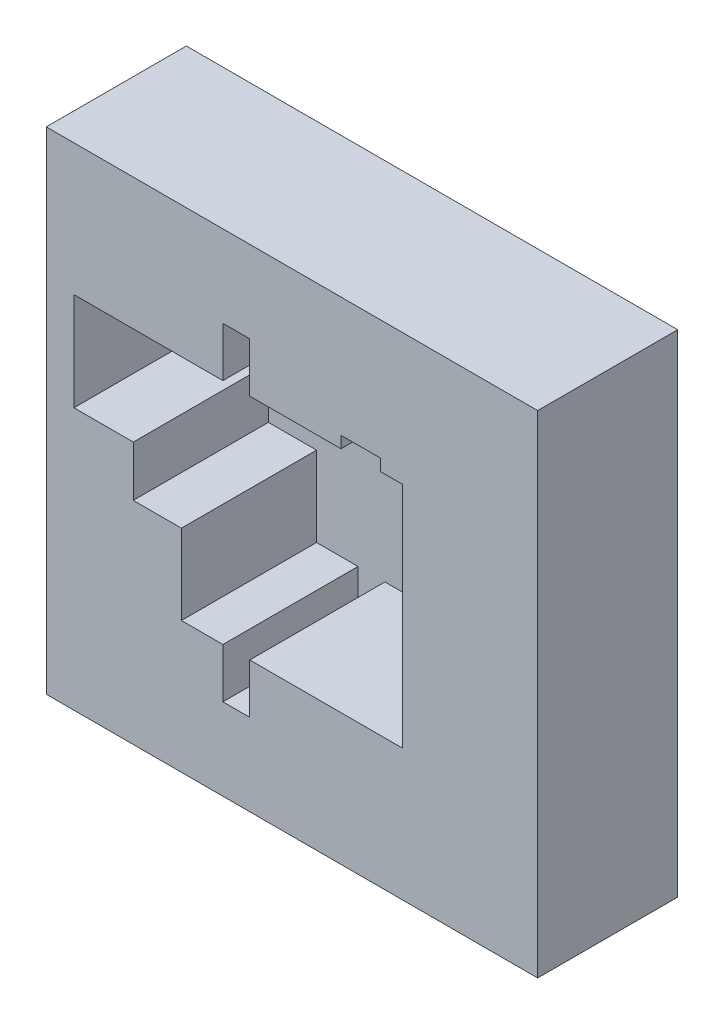
ISO-10303-21;
HEADER;
FILE_DESCRIPTION(('STEP AP214'),'2;1');
FILE_NAME('part.step','',(''),(''),'','','');
FILE_SCHEMA(('AUTOMOTIVE_DESIGN { 1 0 10303 214 1 1 1 1 }'));
ENDSEC;
DATA;
#1=APPLICATION_CONTEXT('core data for automotive mechanical design processes');
#2=APPLICATION_PROTOCOL_DEFINITION('international standard','automotive_design',2000,#1);
#3=PRODUCT_CONTEXT('',#1,'mechanical');
#4=PRODUCT('Part','Part','',(#3));
#5=PRODUCT_RELATED_PRODUCT_CATEGORY('part','',(#4));
#6=PRODUCT_DEFINITION_FORMATION('','',#4);
#7=PRODUCT_DEFINITION_CONTEXT('part definition',#1,'design');
#8=PRODUCT_DEFINITION('design','',#6,#7);
#9=PRODUCT_DEFINITION_SHAPE('','',#8);
#10=(LENGTH_UNIT() NAMED_UNIT(*) SI_UNIT(.MILLI.,.METRE.));
#11=(NAMED_UNIT(*) PLANE_ANGLE_UNIT() SI_UNIT($,.RADIAN.));
#12=(NAMED_UNIT(*) SI_UNIT($,.STERADIAN.) SOLID_ANGLE_UNIT());
#13=UNCERTAINTY_MEASURE_WITH_UNIT(LENGTH_MEASURE(1.E-05),#10,'distance_accuracy_value','');
#14=(GEOMETRIC_REPRESENTATION_CONTEXT(3) GLOBAL_UNCERTAINTY_ASSIGNED_CONTEXT((#13)) GLOBAL_UNIT_ASSIGNED_CONTEXT((#10,
#11,#12)) REPRESENTATION_CONTEXT('',''));
#15=CARTESIAN_POINT('',(0.,0.,0.));
#16=DIRECTION('',(0.,0.,1.));
#17=DIRECTION('',(1.,0.,0.));
#18=AXIS2_PLACEMENT_3D('',#15,#16,#17);
#19=CARTESIAN_POINT('',(-48.3281879194631,53.2718120805369,14.478));
#20=DIRECTION('',(1.,0.,0.));
#21=DIRECTION('',(0.,1.,0.));
#22=AXIS2_PLACEMENT_3D('',#19,#20,#21);
#23=PLANE('',#22);
#24=DIRECTION('',(0.,-1.,0.));
#25=VECTOR('',#24,1.);
#26=CARTESIAN_POINT('',(-48.3281879194631,53.2718120805369,0.));
#27=LINE('',#26,#25);
#28=CARTESIAN_POINT('',(-48.3281879194631,53.2718120805369,0.));
#29=VERTEX_POINT('',#28);
#30=CARTESIAN_POINT('',(-48.3281879194631,2.47181208053691,0.));
#31=VERTEX_POINT('',#30);
#32=EDGE_CURVE('E370',#29,#31,#27,.T.);
#33=ORIENTED_EDGE('',*,*,#32,.T.);
#34=DIRECTION('',(0.,0.,-1.));
#35=VECTOR('',#34,1.);
#36=CARTESIAN_POINT('',(-48.3281879194631,2.47181208053691,14.478));
#37=LINE('',#36,#35);
#38=CARTESIAN_POINT('',(-48.3281879194631,2.47181208053691,14.478));
#39=VERTEX_POINT('',#38);
#40=EDGE_CURVE('E11',#39,#31,#37,.T.);
#41=ORIENTED_EDGE('',*,*,#40,.F.);
#42=DIRECTION('',(0.,-1.,0.));
#43=VECTOR('',#42,1.);
#44=CARTESIAN_POINT('',(-48.3281879194631,53.2718120805369,14.478));
#45=LINE('',#44,#43);
#46=CARTESIAN_POINT('',(-48.3281879194631,53.2718120805369,14.478));
#47=VERTEX_POINT('',#46);
#48=EDGE_CURVE('E424',#47,#39,#45,.T.);
#49=ORIENTED_EDGE('',*,*,#48,.F.);
#50=DIRECTION('',(0.,0.,-1.));
#51=VECTOR('',#50,1.);
#52=CARTESIAN_POINT('',(-48.3281879194631,53.2718120805369,14.478));
#53=LINE('',#52,#51);
#54=EDGE_CURVE('E434',#47,#29,#53,.T.);
#55=ORIENTED_EDGE('',*,*,#54,.T.);
#56=EDGE_LOOP('',(#33,#41,#49,#55));
#57=FACE_BOUND('',#56,.T.);
#58=ADVANCED_FACE('F45',(#57),#23,.F.);
#59=CARTESIAN_POINT('',(-48.3281879194631,2.47181208053691,14.478));
#60=DIRECTION('',(0.,1.,0.));
#61=DIRECTION('',(0.,0.,1.));
#62=AXIS2_PLACEMENT_3D('',#59,#60,#61);
#63=PLANE('',#62);
#64=DIRECTION('',(1.,0.,0.));
#65=VECTOR('',#64,1.);
#66=CARTESIAN_POINT('',(-48.3281879194631,2.47181208053691,0.));
#67=LINE('',#66,#65);
#68=CARTESIAN_POINT('',(2.47181208053693,2.47181208053691,0.));
#69=VERTEX_POINT('',#68);
#70=EDGE_CURVE('E438',#31,#69,#67,.T.);
#71=ORIENTED_EDGE('',*,*,#70,.T.);
#72=DIRECTION('',(0.,0.,-1.));
#73=VECTOR('',#72,1.);
#74=CARTESIAN_POINT('',(2.47181208053693,2.47181208053691,14.478));
#75=LINE('',#74,#73);
#76=CARTESIAN_POINT('',(2.47181208053693,2.47181208053691,14.478));
#77=VERTEX_POINT('',#76);
#78=EDGE_CURVE('E53',#77,#69,#75,.T.);
#79=ORIENTED_EDGE('',*,*,#78,.F.);
#80=DIRECTION('',(1.,0.,0.));
#81=VECTOR('',#80,1.);
#82=CARTESIAN_POINT('',(-48.3281879194631,2.47181208053691,14.478));
#83=LINE('',#82,#81);
#84=EDGE_CURVE('E97',#39,#77,#83,.T.);
#85=ORIENTED_EDGE('',*,*,#84,.F.);
#86=ORIENTED_EDGE('',*,*,#40,.T.);
#87=EDGE_LOOP('',(#71,#79,#85,#86));
#88=FACE_BOUND('',#87,.T.);
#89=ADVANCED_FACE('F474',(#88),#63,.F.);
#90=CARTESIAN_POINT('',(2.47181208053693,53.2718120805369,14.478));
#91=DIRECTION('',(-1.,0.,0.));
#92=DIRECTION('',(0.,0.,1.));
#93=AXIS2_PLACEMENT_3D('',#90,#91,#92);
#94=PLANE('',#93);
#95=DIRECTION('',(0.,1.,0.));
#96=VECTOR('',#95,1.);
#97=CARTESIAN_POINT('',(2.47181208053693,53.2718120805369,0.));
#98=LINE('',#97,#96);
#99=CARTESIAN_POINT('',(2.47181208053693,53.2718120805369,0.));
#100=VERTEX_POINT('',#99);
#101=EDGE_CURVE('E441',#69,#100,#98,.T.);
#102=ORIENTED_EDGE('',*,*,#101,.T.);
#103=DIRECTION('',(0.,0.,-1.));
#104=VECTOR('',#103,1.);
#105=CARTESIAN_POINT('',(2.47181208053693,53.2718120805369,14.478));
#106=LINE('',#105,#104);
#107=CARTESIAN_POINT('',(2.47181208053693,53.2718120805369,14.478));
#108=VERTEX_POINT('',#107);
#109=EDGE_CURVE('E448',#108,#100,#106,.T.);
#110=ORIENTED_EDGE('',*,*,#109,.F.);
#111=DIRECTION('',(0.,1.,0.));
#112=VECTOR('',#111,1.);
#113=CARTESIAN_POINT('',(2.47181208053693,53.2718120805369,14.478));
#114=LINE('',#113,#112);
#115=EDGE_CURVE('E429',#77,#108,#114,.T.);
#116=ORIENTED_EDGE('',*,*,#115,.F.);
#117=ORIENTED_EDGE('',*,*,#78,.T.);
#118=EDGE_LOOP('',(#102,#110,#116,#117));
#119=FACE_BOUND('',#118,.T.);
#120=ADVANCED_FACE('F455',(#119),#94,.F.);
#121=CARTESIAN_POINT('',(-48.3281879194631,53.2718120805369,14.478));
#122=DIRECTION('',(0.,-1.,0.));
#123=DIRECTION('',(0.,0.,-1.));
#124=AXIS2_PLACEMENT_3D('',#121,#122,#123);
#125=PLANE('',#124);
#126=DIRECTION('',(-1.,0.,0.));
#127=VECTOR('',#126,1.);
#128=CARTESIAN_POINT('',(-48.3281879194631,53.2718120805369,0.));
#129=LINE('',#128,#127);
#130=EDGE_CURVE('E90',#100,#29,#129,.T.);
#131=ORIENTED_EDGE('',*,*,#130,.T.);
#132=ORIENTED_EDGE('',*,*,#54,.F.);
#133=DIRECTION('',(-1.,0.,0.));
#134=VECTOR('',#133,1.);
#135=CARTESIAN_POINT('',(-48.3281879194631,53.2718120805369,14.478));
#136=LINE('',#135,#134);
#137=EDGE_CURVE('E69',#108,#47,#136,.T.);
#138=ORIENTED_EDGE('',*,*,#137,.F.);
#139=ORIENTED_EDGE('',*,*,#109,.T.);
#140=EDGE_LOOP('',(#131,#132,#138,#139));
#141=FACE_BOUND('',#140,.T.);
#142=ADVANCED_FACE('F463',(#141),#125,.F.);
#143=CARTESIAN_POINT('',(0.,0.,14.478));
#144=DIRECTION('',(0.,0.,1.));
#145=DIRECTION('',(1.,0.,0.));
#146=AXIS2_PLACEMENT_3D('',#143,#144,#145);
#147=PLANE('',#146);
#148=DIRECTION('',(0.,1.,0.));
#149=VECTOR('',#148,1.);
#150=CARTESIAN_POINT('',(-27.2934191877891,0.,14.478));
#151=LINE('',#150,#149);
#152=CARTESIAN_POINT('',(-27.2934191877891,10.9279897778183,14.478));
#153=VERTEX_POINT('',#152);
#154=CARTESIAN_POINT('',(-27.2934191877891,16.0608120805369,14.478));
#155=VERTEX_POINT('',#154);
#156=EDGE_CURVE('E60',#153,#155,#151,.T.);
#157=ORIENTED_EDGE('',*,*,#156,.F.);
#158=DIRECTION('',(1.,0.,0.));
#159=VECTOR('',#158,1.);
#160=CARTESIAN_POINT('',(0.,10.9279897778183,14.478));
#161=LINE('',#160,#159);
#162=CARTESIAN_POINT('',(-30.068469342103,10.9279897778183,14.478));
#163=VERTEX_POINT('',#162);
#164=EDGE_CURVE('E239',#163,#153,#161,.T.);
#165=ORIENTED_EDGE('',*,*,#164,.F.);
#166=DIRECTION('',(0.,-1.,0.));
#167=VECTOR('',#166,1.);
#168=CARTESIAN_POINT('',(-30.068469342103,0.,14.478));
#169=LINE('',#168,#167);
#170=CARTESIAN_POINT('',(-30.068469342103,16.0608120805369,14.478));
#171=VERTEX_POINT('',#170);
#172=EDGE_CURVE('E243',#171,#163,#169,.T.);
#173=ORIENTED_EDGE('',*,*,#172,.F.);
#174=DIRECTION('',(1.,0.,0.));
#175=VECTOR('',#174,1.);
#176=CARTESIAN_POINT('',(0.,16.0608120805369,14.478));
#177=LINE('',#176,#175);
#178=CARTESIAN_POINT('',(-34.3581879194631,16.0608120805369,14.478));
#179=VERTEX_POINT('',#178);
#180=EDGE_CURVE('E360',#179,#171,#177,.T.);
#181=ORIENTED_EDGE('',*,*,#180,.F.);
#182=DIRECTION('',(0.,-1.,0.));
#183=VECTOR('',#182,1.);
#184=CARTESIAN_POINT('',(-34.3581879194631,0.,14.478));
#185=LINE('',#184,#183);
#186=CARTESIAN_POINT('',(-34.3581879194631,24.3292763036377,14.478));
#187=VERTEX_POINT('',#186);
#188=EDGE_CURVE('E356',#187,#179,#185,.T.);
#189=ORIENTED_EDGE('',*,*,#188,.F.);
#190=DIRECTION('',(-1.,0.,0.));
#191=VECTOR('',#190,1.);
#192=CARTESIAN_POINT('',(0.,24.3292763036377,14.478));
#193=LINE('',#192,#191);
#194=CARTESIAN_POINT('',(-39.3328036576496,24.3292763036377,14.478));
#195=VERTEX_POINT('',#194);
#196=EDGE_CURVE('E352',#187,#195,#193,.T.);
#197=ORIENTED_EDGE('',*,*,#196,.T.);
#198=DIRECTION('',(0.,1.,0.));
#199=VECTOR('',#198,1.);
#200=CARTESIAN_POINT('',(-39.3328036576496,0.,14.478));
#201=LINE('',#200,#199);
#202=CARTESIAN_POINT('',(-39.3328036576496,29.5515326181775,14.478));
#203=VERTEX_POINT('',#202);
#204=EDGE_CURVE('E348',#195,#203,#201,.T.);
#205=ORIENTED_EDGE('',*,*,#204,.T.);
#206=DIRECTION('',(-1.,0.,0.));
#207=VECTOR('',#206,1.);
#208=CARTESIAN_POINT('',(0.,29.5515326181775,14.478));
#209=LINE('',#208,#207);
#210=CARTESIAN_POINT('',(-45.4668825032995,29.5515326181775,14.478));
#211=VERTEX_POINT('',#210);
#212=EDGE_CURVE('E344',#203,#211,#209,.T.);
#213=ORIENTED_EDGE('',*,*,#212,.T.);
#214=DIRECTION('',(0.,1.,0.));
#215=VECTOR('',#214,1.);
#216=CARTESIAN_POINT('',(-45.4668825032995,0.,14.478));
#217=LINE('',#216,#215);
#218=CARTESIAN_POINT('',(-45.4668825032995,39.6828120805369,14.478));
#219=VERTEX_POINT('',#218);
#220=EDGE_CURVE('E340',#211,#219,#217,.T.);
#221=ORIENTED_EDGE('',*,*,#220,.T.);
#222=DIRECTION('',(1.,0.,0.));
#223=VECTOR('',#222,1.);
#224=CARTESIAN_POINT('',(0.,39.6828120805369,14.478));
#225=LINE('',#224,#223);
#226=CARTESIAN_POINT('',(-30.068469342103,39.6828120805369,14.478));
#227=VERTEX_POINT('',#226);
#228=EDGE_CURVE('E336',#219,#227,#225,.T.);
#229=ORIENTED_EDGE('',*,*,#228,.T.);
#230=DIRECTION('',(0.,1.,0.));
#231=VECTOR('',#230,1.);
#232=CARTESIAN_POINT('',(-30.068469342103,0.,14.478));
#233=LINE('',#232,#231);
#234=CARTESIAN_POINT('',(-30.068469342103,44.8119562046641,14.478));
#235=VERTEX_POINT('',#234);
#236=EDGE_CURVE('E332',#227,#235,#233,.T.);
#237=ORIENTED_EDGE('',*,*,#236,.T.);
#238=DIRECTION('',(1.,0.,0.));
#239=VECTOR('',#238,1.);
#240=CARTESIAN_POINT('',(0.,44.8119562046641,14.478));
#241=LINE('',#240,#239);
#242=CARTESIAN_POINT('',(-27.2934191877891,44.8119562046641,14.478));
#243=VERTEX_POINT('',#242);
#244=EDGE_CURVE('E328',#235,#243,#241,.T.);
#245=ORIENTED_EDGE('',*,*,#244,.T.);
#246=DIRECTION('',(0.,-1.,0.));
#247=VECTOR('',#246,1.);
#248=CARTESIAN_POINT('',(-27.2934191877891,0.,14.478));
#249=LINE('',#248,#247);
#250=CARTESIAN_POINT('',(-27.2934191877891,39.6828120805369,14.478));
#251=VERTEX_POINT('',#250);
#252=EDGE_CURVE('E324',#243,#251,#249,.T.);
#253=ORIENTED_EDGE('',*,*,#252,.T.);
#254=DIRECTION('',(1.,0.,0.));
#255=VECTOR('',#254,1.);
#256=CARTESIAN_POINT('',(0.,39.6828120805369,14.478));
#257=LINE('',#256,#255);
#258=CARTESIAN_POINT('',(-17.8687467457195,39.6828120805369,14.478));
#259=VERTEX_POINT('',#258);
#260=EDGE_CURVE('E312',#251,#259,#257,.T.);
#261=ORIENTED_EDGE('',*,*,#260,.T.);
#262=DIRECTION('',(0.,1.,0.));
#263=VECTOR('',#262,1.);
#264=CARTESIAN_POINT('',(-17.8687467457195,0.,14.478));
#265=LINE('',#264,#263);
#266=CARTESIAN_POINT('',(-17.8687467457195,40.8903729705941,14.478));
#267=VERTEX_POINT('',#266);
#268=EDGE_CURVE('E320',#259,#267,#265,.T.);
#269=ORIENTED_EDGE('',*,*,#268,.T.);
#270=DIRECTION('',(1.,0.,0.));
#271=VECTOR('',#270,1.);
#272=CARTESIAN_POINT('',(0.,40.8903729705941,14.478));
#273=LINE('',#272,#271);
#274=CARTESIAN_POINT('',(-13.7716823091694,40.8903729705941,14.478));
#275=VERTEX_POINT('',#274);
#276=EDGE_CURVE('E316',#267,#275,#273,.T.);
#277=ORIENTED_EDGE('',*,*,#276,.T.);
#278=DIRECTION('',(0.,-1.,0.));
#279=VECTOR('',#278,1.);
#280=CARTESIAN_POINT('',(-13.7716823091694,0.,14.478));
#281=LINE('',#280,#279);
#282=CARTESIAN_POINT('',(-13.7716823091694,39.6828120805369,14.478));
#283=VERTEX_POINT('',#282);
#284=EDGE_CURVE('E311',#275,#283,#281,.T.);
#285=ORIENTED_EDGE('',*,*,#284,.T.);
#286=CARTESIAN_POINT('',(-11.4981879194631,39.6828120805369,14.478));
#287=VERTEX_POINT('',#286);
#288=EDGE_CURVE('E307',#283,#287,#257,.T.);
#289=ORIENTED_EDGE('',*,*,#288,.T.);
#290=DIRECTION('',(0.,-1.,0.));
#291=VECTOR('',#290,1.);
#292=CARTESIAN_POINT('',(-11.4981879194631,0.,14.478));
#293=LINE('',#292,#291);
#294=CARTESIAN_POINT('',(-11.4981879194631,16.0608120805369,14.478));
#295=VERTEX_POINT('',#294);
#296=EDGE_CURVE('E303',#287,#295,#293,.T.);
#297=ORIENTED_EDGE('',*,*,#296,.T.);
#298=DIRECTION('',(1.,0.,0.));
#299=VECTOR('',#298,1.);
#300=CARTESIAN_POINT('',(0.,16.0608120805369,14.478));
#301=LINE('',#300,#299);
#302=EDGE_CURVE('E300',#155,#295,#301,.T.);
#303=ORIENTED_EDGE('',*,*,#302,.F.);
#304=EDGE_LOOP('',(#157,#165,#173,#181,#189,#197,#205,#213,#221,#229,#237,#245,#253,#261,#269,
#277,#285,#289,#297,#303));
#305=FACE_BOUND('',#304,.T.);
#306=ORIENTED_EDGE('',*,*,#48,.T.);
#307=ORIENTED_EDGE('',*,*,#84,.T.);
#308=ORIENTED_EDGE('',*,*,#115,.T.);
#309=ORIENTED_EDGE('',*,*,#137,.T.);
#310=EDGE_LOOP('',(#306,#307,#308,#309));
#311=FACE_BOUND('',#310,.T.);
#312=ADVANCED_FACE('F465',(#305,#311),#147,.T.);
#313=CARTESIAN_POINT('',(0.,0.,0.));
#314=DIRECTION('',(0.,0.,1.));
#315=DIRECTION('',(1.,0.,0.));
#316=AXIS2_PLACEMENT_3D('',#313,#314,#315);
#317=PLANE('',#316);
#318=ORIENTED_EDGE('',*,*,#32,.F.);
#319=ORIENTED_EDGE('',*,*,#130,.F.);
#320=ORIENTED_EDGE('',*,*,#101,.F.);
#321=ORIENTED_EDGE('',*,*,#70,.F.);
#322=EDGE_LOOP('',(#318,#319,#320,#321));
#323=FACE_BOUND('',#322,.T.);
#324=ADVANCED_FACE('F459',(#323),#317,.F.);
#325=CARTESIAN_POINT('',(-27.2934191877891,0.,0.507999999999996));
#326=DIRECTION('',(1.,0.,0.));
#327=DIRECTION('',(0.,0.,-1.));
#328=AXIS2_PLACEMENT_3D('',#325,#326,#327);
#329=PLANE('',#328);
#330=ORIENTED_EDGE('',*,*,#156,.T.);
#331=DIRECTION('',(0.,0.,1.));
#332=VECTOR('',#331,1.);
#333=CARTESIAN_POINT('',(-27.2934191877891,16.0608120805369,0.507999999999996));
#334=LINE('',#333,#332);
#335=CARTESIAN_POINT('',(-27.2934191877891,16.0608120805369,0.507999999999996));
#336=VERTEX_POINT('',#335);
#337=EDGE_CURVE('E213',#336,#155,#334,.T.);
#338=ORIENTED_EDGE('',*,*,#337,.F.);
#339=DIRECTION('',(0.,1.,0.));
#340=VECTOR('',#339,1.);
#341=CARTESIAN_POINT('',(-27.2934191877891,0.,0.507999999999996));
#342=LINE('',#341,#340);
#343=CARTESIAN_POINT('',(-27.2934191877891,10.9279897778183,0.507999999999996));
#344=VERTEX_POINT('',#343);
#345=EDGE_CURVE('E217',#344,#336,#342,.T.);
#346=ORIENTED_EDGE('',*,*,#345,.F.);
#347=DIRECTION('',(0.,0.,1.));
#348=VECTOR('',#347,1.);
#349=CARTESIAN_POINT('',(-27.2934191877891,10.9279897778183,0.507999999999996));
#350=LINE('',#349,#348);
#351=EDGE_CURVE('E367',#344,#153,#350,.T.);
#352=ORIENTED_EDGE('',*,*,#351,.T.);
#353=EDGE_LOOP('',(#330,#338,#346,#352));
#354=FACE_BOUND('',#353,.T.);
#355=ADVANCED_FACE('F215',(#354),#329,.F.);
#356=CARTESIAN_POINT('',(0.,10.9279897778183,0.507999999999996));
#357=DIRECTION('',(0.,-1.,0.));
#358=DIRECTION('',(0.,0.,-1.));
#359=AXIS2_PLACEMENT_3D('',#356,#357,#358);
#360=PLANE('',#359);
#361=ORIENTED_EDGE('',*,*,#164,.T.);
#362=ORIENTED_EDGE('',*,*,#351,.F.);
#363=DIRECTION('',(1.,0.,0.));
#364=VECTOR('',#363,1.);
#365=CARTESIAN_POINT('',(0.,10.9279897778183,0.507999999999996));
#366=LINE('',#365,#364);
#367=CARTESIAN_POINT('',(-30.068469342103,10.9279897778183,0.507999999999996));
#368=VERTEX_POINT('',#367);
#369=EDGE_CURVE('E224',#368,#344,#366,.T.);
#370=ORIENTED_EDGE('',*,*,#369,.F.);
#371=DIRECTION('',(0.,0.,1.));
#372=VECTOR('',#371,1.);
#373=CARTESIAN_POINT('',(-30.068469342103,10.9279897778183,0.507999999999996));
#374=LINE('',#373,#372);
#375=EDGE_CURVE('E371',#368,#163,#374,.T.);
#376=ORIENTED_EDGE('',*,*,#375,.T.);
#377=EDGE_LOOP('',(#361,#362,#370,#376));
#378=FACE_BOUND('',#377,.T.);
#379=ADVANCED_FACE('F514',(#378),#360,.F.);
#380=CARTESIAN_POINT('',(-30.068469342103,0.,0.507999999999996));
#381=DIRECTION('',(-1.,0.,0.));
#382=DIRECTION('',(0.,0.,1.));
#383=AXIS2_PLACEMENT_3D('',#380,#381,#382);
#384=PLANE('',#383);
#385=ORIENTED_EDGE('',*,*,#172,.T.);
#386=ORIENTED_EDGE('',*,*,#375,.F.);
#387=DIRECTION('',(0.,-1.,0.));
#388=VECTOR('',#387,1.);
#389=CARTESIAN_POINT('',(-30.068469342103,0.,0.507999999999996));
#390=LINE('',#389,#388);
#391=CARTESIAN_POINT('',(-30.068469342103,16.0608120805369,0.507999999999996));
#392=VERTEX_POINT('',#391);
#393=EDGE_CURVE('E293',#392,#368,#390,.T.);
#394=ORIENTED_EDGE('',*,*,#393,.F.);
#395=DIRECTION('',(0.,0.,1.));
#396=VECTOR('',#395,1.);
#397=CARTESIAN_POINT('',(-30.068469342103,16.0608120805369,0.507999999999996));
#398=LINE('',#397,#396);
#399=EDGE_CURVE('E374',#392,#171,#398,.T.);
#400=ORIENTED_EDGE('',*,*,#399,.T.);
#401=EDGE_LOOP('',(#385,#386,#394,#400));
#402=FACE_BOUND('',#401,.T.);
#403=ADVANCED_FACE('F523',(#402),#384,.F.);
#404=CARTESIAN_POINT('',(0.,16.0608120805369,0.507999999999996));
#405=DIRECTION('',(0.,-1.,0.));
#406=DIRECTION('',(0.,0.,-1.));
#407=AXIS2_PLACEMENT_3D('',#404,#405,#406);
#408=PLANE('',#407);
#409=ORIENTED_EDGE('',*,*,#180,.T.);
#410=ORIENTED_EDGE('',*,*,#399,.F.);
#411=DIRECTION('',(1.,0.,0.));
#412=VECTOR('',#411,1.);
#413=CARTESIAN_POINT('',(0.,16.0608120805369,0.507999999999996));
#414=LINE('',#413,#412);
#415=CARTESIAN_POINT('',(-34.3581879194631,16.0608120805369,0.507999999999996));
#416=VERTEX_POINT('',#415);
#417=EDGE_CURVE('E289',#416,#392,#414,.T.);
#418=ORIENTED_EDGE('',*,*,#417,.F.);
#419=DIRECTION('',(0.,0.,1.));
#420=VECTOR('',#419,1.);
#421=CARTESIAN_POINT('',(-34.3581879194631,16.0608120805369,0.507999999999996));
#422=LINE('',#421,#420);
#423=EDGE_CURVE('E377',#416,#179,#422,.T.);
#424=ORIENTED_EDGE('',*,*,#423,.T.);
#425=EDGE_LOOP('',(#409,#410,#418,#424));
#426=FACE_BOUND('',#425,.T.);
#427=ADVANCED_FACE('F533',(#426),#408,.F.);
#428=CARTESIAN_POINT('',(-34.3581879194631,0.,0.507999999999996));
#429=DIRECTION('',(-1.,0.,0.));
#430=DIRECTION('',(0.,0.,1.));
#431=AXIS2_PLACEMENT_3D('',#428,#429,#430);
#432=PLANE('',#431);
#433=ORIENTED_EDGE('',*,*,#188,.T.);
#434=ORIENTED_EDGE('',*,*,#423,.F.);
#435=DIRECTION('',(0.,-1.,0.));
#436=VECTOR('',#435,1.);
#437=CARTESIAN_POINT('',(-34.3581879194631,0.,0.507999999999996));
#438=LINE('',#437,#436);
#439=CARTESIAN_POINT('',(-34.3581879194631,24.3292763036377,0.507999999999996));
#440=VERTEX_POINT('',#439);
#441=EDGE_CURVE('E285',#440,#416,#438,.T.);
#442=ORIENTED_EDGE('',*,*,#441,.F.);
#443=DIRECTION('',(0.,0.,1.));
#444=VECTOR('',#443,1.);
#445=CARTESIAN_POINT('',(-34.3581879194631,24.3292763036377,0.507999999999996));
#446=LINE('',#445,#444);
#447=EDGE_CURVE('E380',#440,#187,#446,.T.);
#448=ORIENTED_EDGE('',*,*,#447,.T.);
#449=EDGE_LOOP('',(#433,#434,#442,#448));
#450=FACE_BOUND('',#449,.T.);
#451=ADVANCED_FACE('F543',(#450),#432,.F.);
#452=CARTESIAN_POINT('',(0.,24.3292763036377,0.507999999999996));
#453=DIRECTION('',(0.,1.,0.));
#454=DIRECTION('',(0.,0.,1.));
#455=AXIS2_PLACEMENT_3D('',#452,#453,#454);
#456=PLANE('',#455);
#457=ORIENTED_EDGE('',*,*,#196,.F.);
#458=ORIENTED_EDGE('',*,*,#447,.F.);
#459=DIRECTION('',(-1.,0.,0.));
#460=VECTOR('',#459,1.);
#461=CARTESIAN_POINT('',(0.,24.3292763036377,0.507999999999996));
#462=LINE('',#461,#460);
#463=CARTESIAN_POINT('',(-39.3328036576496,24.3292763036377,0.507999999999996));
#464=VERTEX_POINT('',#463);
#465=EDGE_CURVE('E282',#440,#464,#462,.T.);
#466=ORIENTED_EDGE('',*,*,#465,.T.);
#467=DIRECTION('',(0.,0.,1.));
#468=VECTOR('',#467,1.);
#469=CARTESIAN_POINT('',(-39.3328036576496,24.3292763036377,0.507999999999996));
#470=LINE('',#469,#468);
#471=EDGE_CURVE('E383',#464,#195,#470,.T.);
#472=ORIENTED_EDGE('',*,*,#471,.T.);
#473=EDGE_LOOP('',(#457,#458,#466,#472));
#474=FACE_BOUND('',#473,.T.);
#475=ADVANCED_FACE('F556',(#474),#456,.T.);
#476=CARTESIAN_POINT('',(-39.3328036576496,0.,0.507999999999996));
#477=DIRECTION('',(1.,0.,0.));
#478=DIRECTION('',(0.,0.,-1.));
#479=AXIS2_PLACEMENT_3D('',#476,#477,#478);
#480=PLANE('',#479);
#481=ORIENTED_EDGE('',*,*,#204,.F.);
#482=ORIENTED_EDGE('',*,*,#471,.F.);
#483=DIRECTION('',(0.,1.,0.));
#484=VECTOR('',#483,1.);
#485=CARTESIAN_POINT('',(-39.3328036576496,0.,0.507999999999996));
#486=LINE('',#485,#484);
#487=CARTESIAN_POINT('',(-39.3328036576496,29.5515326181775,0.507999999999996));
#488=VERTEX_POINT('',#487);
#489=EDGE_CURVE('E279',#464,#488,#486,.T.);
#490=ORIENTED_EDGE('',*,*,#489,.T.);
#491=DIRECTION('',(0.,0.,1.));
#492=VECTOR('',#491,1.);
#493=CARTESIAN_POINT('',(-39.3328036576496,29.5515326181775,0.507999999999996));
#494=LINE('',#493,#492);
#495=EDGE_CURVE('E386',#488,#203,#494,.T.);
#496=ORIENTED_EDGE('',*,*,#495,.T.);
#497=EDGE_LOOP('',(#481,#482,#490,#496));
#498=FACE_BOUND('',#497,.T.);
#499=ADVANCED_FACE('F569',(#498),#480,.T.);
#500=CARTESIAN_POINT('',(0.,29.5515326181775,0.507999999999996));
#501=DIRECTION('',(0.,1.,0.));
#502=DIRECTION('',(0.,0.,1.));
#503=AXIS2_PLACEMENT_3D('',#500,#501,#502);
#504=PLANE('',#503);
#505=ORIENTED_EDGE('',*,*,#212,.F.);
#506=ORIENTED_EDGE('',*,*,#495,.F.);
#507=DIRECTION('',(-1.,0.,0.));
#508=VECTOR('',#507,1.);
#509=CARTESIAN_POINT('',(0.,29.5515326181775,0.507999999999996));
#510=LINE('',#509,#508);
#511=CARTESIAN_POINT('',(-45.4668825032995,29.5515326181775,0.507999999999996));
#512=VERTEX_POINT('',#511);
#513=EDGE_CURVE('E276',#488,#512,#510,.T.);
#514=ORIENTED_EDGE('',*,*,#513,.T.);
#515=DIRECTION('',(0.,0.,1.));
#516=VECTOR('',#515,1.);
#517=CARTESIAN_POINT('',(-45.4668825032995,29.5515326181775,0.507999999999996));
#518=LINE('',#517,#516);
#519=EDGE_CURVE('E389',#512,#211,#518,.T.);
#520=ORIENTED_EDGE('',*,*,#519,.T.);
#521=EDGE_LOOP('',(#505,#506,#514,#520));
#522=FACE_BOUND('',#521,.T.);
#523=ADVANCED_FACE('F579',(#522),#504,.T.);
#524=CARTESIAN_POINT('',(-45.4668825032995,0.,0.507999999999996));
#525=DIRECTION('',(1.,0.,0.));
#526=DIRECTION('',(0.,0.,-1.));
#527=AXIS2_PLACEMENT_3D('',#524,#525,#526);
#528=PLANE('',#527);
#529=ORIENTED_EDGE('',*,*,#220,.F.);
#530=ORIENTED_EDGE('',*,*,#519,.F.);
#531=DIRECTION('',(0.,1.,0.));
#532=VECTOR('',#531,1.);
#533=CARTESIAN_POINT('',(-45.4668825032995,0.,0.507999999999996));
#534=LINE('',#533,#532);
#535=CARTESIAN_POINT('',(-45.4668825032995,39.6828120805369,0.507999999999996));
#536=VERTEX_POINT('',#535);
#537=EDGE_CURVE('E273',#512,#536,#534,.T.);
#538=ORIENTED_EDGE('',*,*,#537,.T.);
#539=DIRECTION('',(0.,0.,1.));
#540=VECTOR('',#539,1.);
#541=CARTESIAN_POINT('',(-45.4668825032995,39.6828120805369,0.507999999999996));
#542=LINE('',#541,#540);
#543=EDGE_CURVE('E392',#536,#219,#542,.T.);
#544=ORIENTED_EDGE('',*,*,#543,.T.);
#545=EDGE_LOOP('',(#529,#530,#538,#544));
#546=FACE_BOUND('',#545,.T.);
#547=ADVANCED_FACE('F592',(#546),#528,.T.);
#548=CARTESIAN_POINT('',(0.,39.6828120805369,0.507999999999996));
#549=DIRECTION('',(0.,-1.,0.));
#550=DIRECTION('',(0.,0.,-1.));
#551=AXIS2_PLACEMENT_3D('',#548,#549,#550);
#552=PLANE('',#551);
#553=ORIENTED_EDGE('',*,*,#228,.F.);
#554=ORIENTED_EDGE('',*,*,#543,.F.);
#555=DIRECTION('',(1.,0.,0.));
#556=VECTOR('',#555,1.);
#557=CARTESIAN_POINT('',(0.,39.6828120805369,0.507999999999996));
#558=LINE('',#557,#556);
#559=CARTESIAN_POINT('',(-30.068469342103,39.6828120805369,0.507999999999996));
#560=VERTEX_POINT('',#559);
#561=EDGE_CURVE('E270',#536,#560,#558,.T.);
#562=ORIENTED_EDGE('',*,*,#561,.T.);
#563=DIRECTION('',(0.,0.,1.));
#564=VECTOR('',#563,1.);
#565=CARTESIAN_POINT('',(-30.068469342103,39.6828120805369,0.507999999999996));
#566=LINE('',#565,#564);
#567=EDGE_CURVE('E395',#560,#227,#566,.T.);
#568=ORIENTED_EDGE('',*,*,#567,.T.);
#569=EDGE_LOOP('',(#553,#554,#562,#568));
#570=FACE_BOUND('',#569,.T.);
#571=ADVANCED_FACE('F602',(#570),#552,.T.);
#572=CARTESIAN_POINT('',(-30.068469342103,0.,0.507999999999996));
#573=DIRECTION('',(1.,0.,0.));
#574=DIRECTION('',(0.,0.,-1.));
#575=AXIS2_PLACEMENT_3D('',#572,#573,#574);
#576=PLANE('',#575);
#577=ORIENTED_EDGE('',*,*,#236,.F.);
#578=ORIENTED_EDGE('',*,*,#567,.F.);
#579=DIRECTION('',(0.,1.,0.));
#580=VECTOR('',#579,1.);
#581=CARTESIAN_POINT('',(-30.068469342103,0.,0.507999999999996));
#582=LINE('',#581,#580);
#583=CARTESIAN_POINT('',(-30.068469342103,44.8119562046641,0.507999999999996));
#584=VERTEX_POINT('',#583);
#585=EDGE_CURVE('E267',#560,#584,#582,.T.);
#586=ORIENTED_EDGE('',*,*,#585,.T.);
#587=DIRECTION('',(0.,0.,1.));
#588=VECTOR('',#587,1.);
#589=CARTESIAN_POINT('',(-30.068469342103,44.8119562046641,0.507999999999996));
#590=LINE('',#589,#588);
#591=EDGE_CURVE('E398',#584,#235,#590,.T.);
#592=ORIENTED_EDGE('',*,*,#591,.T.);
#593=EDGE_LOOP('',(#577,#578,#586,#592));
#594=FACE_BOUND('',#593,.T.);
#595=ADVANCED_FACE('F612',(#594),#576,.T.);
#596=CARTESIAN_POINT('',(0.,44.8119562046641,0.507999999999996));
#597=DIRECTION('',(0.,-1.,0.));
#598=DIRECTION('',(0.,0.,-1.));
#599=AXIS2_PLACEMENT_3D('',#596,#597,#598);
#600=PLANE('',#599);
#601=ORIENTED_EDGE('',*,*,#244,.F.);
#602=ORIENTED_EDGE('',*,*,#591,.F.);
#603=DIRECTION('',(1.,0.,0.));
#604=VECTOR('',#603,1.);
#605=CARTESIAN_POINT('',(0.,44.8119562046641,0.507999999999996));
#606=LINE('',#605,#604);
#607=CARTESIAN_POINT('',(-27.2934191877891,44.8119562046641,0.507999999999996));
#608=VERTEX_POINT('',#607);
#609=EDGE_CURVE('E264',#584,#608,#606,.T.);
#610=ORIENTED_EDGE('',*,*,#609,.T.);
#611=DIRECTION('',(0.,0.,1.));
#612=VECTOR('',#611,1.);
#613=CARTESIAN_POINT('',(-27.2934191877891,44.8119562046641,0.507999999999996));
#614=LINE('',#613,#612);
#615=EDGE_CURVE('E401',#608,#243,#614,.T.);
#616=ORIENTED_EDGE('',*,*,#615,.T.);
#617=EDGE_LOOP('',(#601,#602,#610,#616));
#618=FACE_BOUND('',#617,.T.);
#619=ADVANCED_FACE('F637',(#618),#600,.T.);
#620=CARTESIAN_POINT('',(-27.2934191877891,0.,0.507999999999996));
#621=DIRECTION('',(-1.,0.,0.));
#622=DIRECTION('',(0.,0.,1.));
#623=AXIS2_PLACEMENT_3D('',#620,#621,#622);
#624=PLANE('',#623);
#625=ORIENTED_EDGE('',*,*,#252,.F.);
#626=ORIENTED_EDGE('',*,*,#615,.F.);
#627=DIRECTION('',(0.,-1.,0.));
#628=VECTOR('',#627,1.);
#629=CARTESIAN_POINT('',(-27.2934191877891,0.,0.507999999999996));
#630=LINE('',#629,#628);
#631=CARTESIAN_POINT('',(-27.2934191877891,39.6828120805369,0.507999999999996));
#632=VERTEX_POINT('',#631);
#633=EDGE_CURVE('E261',#608,#632,#630,.T.);
#634=ORIENTED_EDGE('',*,*,#633,.T.);
#635=DIRECTION('',(0.,0.,1.));
#636=VECTOR('',#635,1.);
#637=CARTESIAN_POINT('',(-27.2934191877891,39.6828120805369,0.507999999999996));
#638=LINE('',#637,#636);
#639=EDGE_CURVE('E404',#632,#251,#638,.T.);
#640=ORIENTED_EDGE('',*,*,#639,.T.);
#641=EDGE_LOOP('',(#625,#626,#634,#640));
#642=FACE_BOUND('',#641,.T.);
#643=ADVANCED_FACE('F647',(#642),#624,.T.);
#644=CARTESIAN_POINT('',(0.,39.6828120805369,0.507999999999996));
#645=DIRECTION('',(0.,-1.,0.));
#646=DIRECTION('',(0.,0.,-1.));
#647=AXIS2_PLACEMENT_3D('',#644,#645,#646);
#648=PLANE('',#647);
#649=ORIENTED_EDGE('',*,*,#260,.F.);
#650=ORIENTED_EDGE('',*,*,#639,.F.);
#651=DIRECTION('',(1.,0.,0.));
#652=VECTOR('',#651,1.);
#653=CARTESIAN_POINT('',(0.,39.6828120805369,0.507999999999996));
#654=LINE('',#653,#652);
#655=CARTESIAN_POINT('',(-17.8687467457195,39.6828120805369,0.507999999999996));
#656=VERTEX_POINT('',#655);
#657=EDGE_CURVE('E252',#632,#656,#654,.T.);
#658=ORIENTED_EDGE('',*,*,#657,.T.);
#659=DIRECTION('',(0.,0.,1.));
#660=VECTOR('',#659,1.);
#661=CARTESIAN_POINT('',(-17.8687467457195,39.6828120805369,0.507999999999996));
#662=LINE('',#661,#660);
#663=EDGE_CURVE('E407',#656,#259,#662,.T.);
#664=ORIENTED_EDGE('',*,*,#663,.T.);
#665=EDGE_LOOP('',(#649,#650,#658,#664));
#666=FACE_BOUND('',#665,.T.);
#667=ADVANCED_FACE('F657',(#666),#648,.T.);
#668=CARTESIAN_POINT('',(-17.8687467457195,0.,0.507999999999996));
#669=DIRECTION('',(1.,0.,0.));
#670=DIRECTION('',(0.,0.,-1.));
#671=AXIS2_PLACEMENT_3D('',#668,#669,#670);
#672=PLANE('',#671);
#673=ORIENTED_EDGE('',*,*,#268,.F.);
#674=ORIENTED_EDGE('',*,*,#663,.F.);
#675=DIRECTION('',(0.,1.,0.));
#676=VECTOR('',#675,1.);
#677=CARTESIAN_POINT('',(-17.8687467457195,0.,0.507999999999996));
#678=LINE('',#677,#676);
#679=CARTESIAN_POINT('',(-17.8687467457195,40.8903729705941,0.507999999999996));
#680=VERTEX_POINT('',#679);
#681=EDGE_CURVE('E258',#656,#680,#678,.T.);
#682=ORIENTED_EDGE('',*,*,#681,.T.);
#683=DIRECTION('',(0.,0.,1.));
#684=VECTOR('',#683,1.);
#685=CARTESIAN_POINT('',(-17.8687467457195,40.8903729705941,0.507999999999996));
#686=LINE('',#685,#684);
#687=EDGE_CURVE('E410',#680,#267,#686,.T.);
#688=ORIENTED_EDGE('',*,*,#687,.T.);
#689=EDGE_LOOP('',(#673,#674,#682,#688));
#690=FACE_BOUND('',#689,.T.);
#691=ADVANCED_FACE('F667',(#690),#672,.T.);
#692=CARTESIAN_POINT('',(0.,40.8903729705941,0.507999999999996));
#693=DIRECTION('',(0.,-1.,0.));
#694=DIRECTION('',(0.,0.,-1.));
#695=AXIS2_PLACEMENT_3D('',#692,#693,#694);
#696=PLANE('',#695);
#697=ORIENTED_EDGE('',*,*,#276,.F.);
#698=ORIENTED_EDGE('',*,*,#687,.F.);
#699=DIRECTION('',(1.,0.,0.));
#700=VECTOR('',#699,1.);
#701=CARTESIAN_POINT('',(0.,40.8903729705941,0.507999999999996));
#702=LINE('',#701,#700);
#703=CARTESIAN_POINT('',(-13.7716823091694,40.8903729705941,0.507999999999996));
#704=VERTEX_POINT('',#703);
#705=EDGE_CURVE('E255',#680,#704,#702,.T.);
#706=ORIENTED_EDGE('',*,*,#705,.T.);
#707=DIRECTION('',(0.,0.,1.));
#708=VECTOR('',#707,1.);
#709=CARTESIAN_POINT('',(-13.7716823091694,40.8903729705941,0.507999999999996));
#710=LINE('',#709,#708);
#711=EDGE_CURVE('E413',#704,#275,#710,.T.);
#712=ORIENTED_EDGE('',*,*,#711,.T.);
#713=EDGE_LOOP('',(#697,#698,#706,#712));
#714=FACE_BOUND('',#713,.T.);
#715=ADVANCED_FACE('F687',(#714),#696,.T.);
#716=CARTESIAN_POINT('',(-13.7716823091694,0.,0.507999999999996));
#717=DIRECTION('',(-1.,0.,0.));
#718=DIRECTION('',(0.,0.,1.));
#719=AXIS2_PLACEMENT_3D('',#716,#717,#718);
#720=PLANE('',#719);
#721=ORIENTED_EDGE('',*,*,#284,.F.);
#722=ORIENTED_EDGE('',*,*,#711,.F.);
#723=DIRECTION('',(0.,-1.,0.));
#724=VECTOR('',#723,1.);
#725=CARTESIAN_POINT('',(-13.7716823091694,0.,0.507999999999996));
#726=LINE('',#725,#724);
#727=CARTESIAN_POINT('',(-13.7716823091694,39.6828120805369,0.507999999999996));
#728=VERTEX_POINT('',#727);
#729=EDGE_CURVE('E251',#704,#728,#726,.T.);
#730=ORIENTED_EDGE('',*,*,#729,.T.);
#731=DIRECTION('',(0.,0.,1.));
#732=VECTOR('',#731,1.);
#733=CARTESIAN_POINT('',(-13.7716823091694,39.6828120805369,0.507999999999996));
#734=LINE('',#733,#732);
#735=EDGE_CURVE('E416',#728,#283,#734,.T.);
#736=ORIENTED_EDGE('',*,*,#735,.T.);
#737=EDGE_LOOP('',(#721,#722,#730,#736));
#738=FACE_BOUND('',#737,.T.);
#739=ADVANCED_FACE('F697',(#738),#720,.T.);
#740=ORIENTED_EDGE('',*,*,#288,.F.);
#741=ORIENTED_EDGE('',*,*,#735,.F.);
#742=CARTESIAN_POINT('',(-11.4981879194631,39.6828120805369,0.507999999999996));
#743=VERTEX_POINT('',#742);
#744=EDGE_CURVE('E248',#728,#743,#654,.T.);
#745=ORIENTED_EDGE('',*,*,#744,.T.);
#746=DIRECTION('',(0.,0.,1.));
#747=VECTOR('',#746,1.);
#748=CARTESIAN_POINT('',(-11.4981879194631,39.6828120805369,0.507999999999996));
#749=LINE('',#748,#747);
#750=EDGE_CURVE('E419',#743,#287,#749,.T.);
#751=ORIENTED_EDGE('',*,*,#750,.T.);
#752=EDGE_LOOP('',(#740,#741,#745,#751));
#753=FACE_BOUND('',#752,.T.);
#754=ADVANCED_FACE('F670',(#753),#648,.T.);
#755=CARTESIAN_POINT('',(-11.4981879194631,0.,0.507999999999996));
#756=DIRECTION('',(-1.,0.,0.));
#757=DIRECTION('',(0.,-1.,0.));
#758=AXIS2_PLACEMENT_3D('',#755,#756,#757);
#759=PLANE('',#758);
#760=ORIENTED_EDGE('',*,*,#296,.F.);
#761=ORIENTED_EDGE('',*,*,#750,.F.);
#762=DIRECTION('',(0.,-1.,0.));
#763=VECTOR('',#762,1.);
#764=CARTESIAN_POINT('',(-11.4981879194631,0.,0.507999999999996));
#765=LINE('',#764,#763);
#766=CARTESIAN_POINT('',(-11.4981879194631,16.0608120805369,0.507999999999996));
#767=VERTEX_POINT('',#766);
#768=EDGE_CURVE('E233',#743,#767,#765,.T.);
#769=ORIENTED_EDGE('',*,*,#768,.T.);
#770=DIRECTION('',(0.,0.,1.));
#771=VECTOR('',#770,1.);
#772=CARTESIAN_POINT('',(-11.4981879194631,16.0608120805369,0.507999999999996));
#773=LINE('',#772,#771);
#774=EDGE_CURVE('E223',#767,#295,#773,.T.);
#775=ORIENTED_EDGE('',*,*,#774,.T.);
#776=EDGE_LOOP('',(#760,#761,#769,#775));
#777=FACE_BOUND('',#776,.T.);
#778=ADVANCED_FACE('F716',(#777),#759,.T.);
#779=CARTESIAN_POINT('',(0.,16.0608120805369,0.507999999999996));
#780=DIRECTION('',(0.,-1.,0.));
#781=DIRECTION('',(0.,0.,-1.));
#782=AXIS2_PLACEMENT_3D('',#779,#780,#781);
#783=PLANE('',#782);
#784=ORIENTED_EDGE('',*,*,#302,.T.);
#785=ORIENTED_EDGE('',*,*,#774,.F.);
#786=DIRECTION('',(1.,0.,0.));
#787=VECTOR('',#786,1.);
#788=CARTESIAN_POINT('',(0.,16.0608120805369,0.507999999999996));
#789=LINE('',#788,#787);
#790=EDGE_CURVE('E228',#336,#767,#789,.T.);
#791=ORIENTED_EDGE('',*,*,#790,.F.);
#792=ORIENTED_EDGE('',*,*,#337,.T.);
#793=EDGE_LOOP('',(#784,#785,#791,#792));
#794=FACE_BOUND('',#793,.T.);
#795=ADVANCED_FACE('F229',(#794),#783,.F.);
#796=CARTESIAN_POINT('',(0.,0.,0.507999999999996));
#797=DIRECTION('',(0.,0.,1.));
#798=DIRECTION('',(1.,0.,0.));
#799=AXIS2_PLACEMENT_3D('',#796,#797,#798);
#800=PLANE('',#799);
#801=ORIENTED_EDGE('',*,*,#345,.T.);
#802=ORIENTED_EDGE('',*,*,#790,.T.);
#803=ORIENTED_EDGE('',*,*,#768,.F.);
#804=ORIENTED_EDGE('',*,*,#744,.F.);
#805=ORIENTED_EDGE('',*,*,#729,.F.);
#806=ORIENTED_EDGE('',*,*,#705,.F.);
#807=ORIENTED_EDGE('',*,*,#681,.F.);
#808=ORIENTED_EDGE('',*,*,#657,.F.);
#809=ORIENTED_EDGE('',*,*,#633,.F.);
#810=ORIENTED_EDGE('',*,*,#609,.F.);
#811=ORIENTED_EDGE('',*,*,#585,.F.);
#812=ORIENTED_EDGE('',*,*,#561,.F.);
#813=ORIENTED_EDGE('',*,*,#537,.F.);
#814=ORIENTED_EDGE('',*,*,#513,.F.);
#815=ORIENTED_EDGE('',*,*,#489,.F.);
#816=ORIENTED_EDGE('',*,*,#465,.F.);
#817=ORIENTED_EDGE('',*,*,#441,.T.);
#818=ORIENTED_EDGE('',*,*,#417,.T.);
#819=ORIENTED_EDGE('',*,*,#393,.T.);
#820=ORIENTED_EDGE('',*,*,#369,.T.);
#821=EDGE_LOOP('',(#801,#802,#803,#804,#805,#806,#807,#808,#809,#810,#811,#812,#813,#814,#815,
#816,#817,#818,#819,#820));
#822=FACE_BOUND('',#821,.T.);
#823=ADVANCED_FACE('F235',(#822),#800,.T.);
#824=CLOSED_SHELL('',(#58,#89,#120,#142,#312,#324,#355,#379,#403,#427,#451,#475,#499,#523,#547,
#571,#595,#619,#643,#667,#691,#715,#739,#754,#778,#795,#823));
#825=MANIFOLD_SOLID_BREP('B2',#824);
#826=ADVANCED_BREP_SHAPE_REPRESENTATION('',(#18,#825),#14);
#827=SHAPE_DEFINITION_REPRESENTATION(#9,#826);
ENDSEC;
END-ISO-10303-21;
